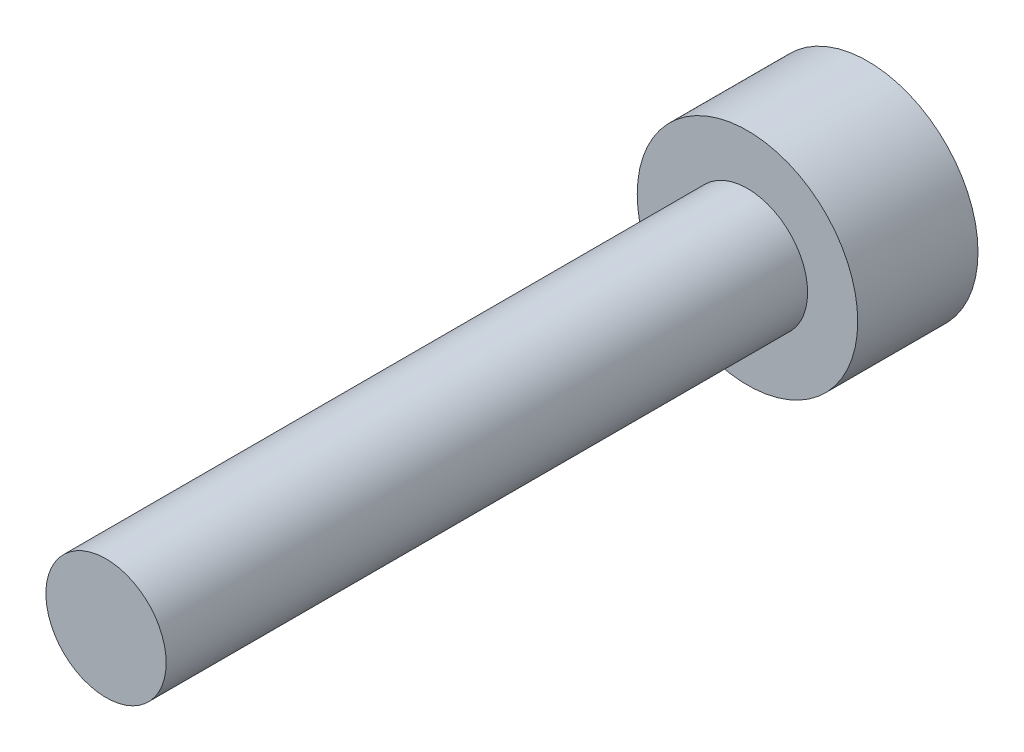
ISO-10303-21;
HEADER;
FILE_DESCRIPTION(('STEP AP214'),'2;1');
FILE_NAME('part.step','',(''),(''),'','','');
FILE_SCHEMA(('AUTOMOTIVE_DESIGN { 1 0 10303 214 1 1 1 1 }'));
ENDSEC;
DATA;
#1=APPLICATION_CONTEXT('core data for automotive mechanical design processes');
#2=APPLICATION_PROTOCOL_DEFINITION('international standard','automotive_design',2000,#1);
#3=PRODUCT_CONTEXT('',#1,'mechanical');
#4=PRODUCT('Part','Part','',(#3));
#5=PRODUCT_RELATED_PRODUCT_CATEGORY('part','',(#4));
#6=PRODUCT_DEFINITION_FORMATION('','',#4);
#7=PRODUCT_DEFINITION_CONTEXT('part definition',#1,'design');
#8=PRODUCT_DEFINITION('design','',#6,#7);
#9=PRODUCT_DEFINITION_SHAPE('','',#8);
#10=(LENGTH_UNIT() NAMED_UNIT(*) SI_UNIT(.MILLI.,.METRE.));
#11=(NAMED_UNIT(*) PLANE_ANGLE_UNIT() SI_UNIT($,.RADIAN.));
#12=(NAMED_UNIT(*) SI_UNIT($,.STERADIAN.) SOLID_ANGLE_UNIT());
#13=UNCERTAINTY_MEASURE_WITH_UNIT(LENGTH_MEASURE(1.E-05),#10,'distance_accuracy_value','');
#14=(GEOMETRIC_REPRESENTATION_CONTEXT(3) GLOBAL_UNCERTAINTY_ASSIGNED_CONTEXT((#13)) GLOBAL_UNIT_ASSIGNED_CONTEXT((#10,
#11,#12)) REPRESENTATION_CONTEXT('',''));
#15=CARTESIAN_POINT('',(0.,0.,0.));
#16=DIRECTION('',(0.,0.,1.));
#17=DIRECTION('',(1.,0.,0.));
#18=AXIS2_PLACEMENT_3D('',#15,#16,#17);
#19=CARTESIAN_POINT('',(0.,0.,16.));
#20=DIRECTION('',(0.,0.,-1.));
#21=DIRECTION('',(-1.,0.,0.));
#22=AXIS2_PLACEMENT_3D('',#19,#20,#21);
#23=CYLINDRICAL_SURFACE('',#22,1.5);
#24=CARTESIAN_POINT('',(0.,0.,16.));
#25=DIRECTION('',(0.,0.,1.));
#26=DIRECTION('',(1.,0.,0.));
#27=AXIS2_PLACEMENT_3D('',#24,#25,#26);
#28=CIRCLE('',#27,1.5);
#29=CARTESIAN_POINT('',(1.5,0.,16.));
#30=VERTEX_POINT('',#29);
#31=EDGE_CURVE('E10',#30,#30,#28,.T.);
#32=ORIENTED_EDGE('',*,*,#31,.F.);
#33=EDGE_LOOP('',(#32));
#34=FACE_BOUND('',#33,.T.);
#35=CARTESIAN_POINT('',(0.,0.,0.));
#36=DIRECTION('',(0.,0.,1.));
#37=DIRECTION('',(1.,0.,0.));
#38=AXIS2_PLACEMENT_3D('',#35,#36,#37);
#39=CIRCLE('',#38,1.5);
#40=CARTESIAN_POINT('',(1.5,0.,0.));
#41=VERTEX_POINT('',#40);
#42=EDGE_CURVE('E36',#41,#41,#39,.T.);
#43=ORIENTED_EDGE('',*,*,#42,.T.);
#44=EDGE_LOOP('',(#43));
#45=FACE_BOUND('',#44,.T.);
#46=ADVANCED_FACE('F33',(#34,#45),#23,.T.);
#47=CARTESIAN_POINT('',(0.,0.,16.));
#48=DIRECTION('',(0.,0.,1.));
#49=DIRECTION('',(1.,0.,0.));
#50=AXIS2_PLACEMENT_3D('',#47,#48,#49);
#51=PLANE('',#50);
#52=ORIENTED_EDGE('',*,*,#31,.T.);
#53=EDGE_LOOP('',(#52));
#54=FACE_BOUND('',#53,.T.);
#55=ADVANCED_FACE('F56',(#54),#51,.T.);
#56=CARTESIAN_POINT('',(0.,0.,0.));
#57=DIRECTION('',(0.,0.,-1.));
#58=DIRECTION('',(-1.,0.,0.));
#59=AXIS2_PLACEMENT_3D('',#56,#57,#58);
#60=CYLINDRICAL_SURFACE('',#59,2.75);
#61=CARTESIAN_POINT('',(0.,0.,0.));
#62=DIRECTION('',(0.,0.,1.));
#63=DIRECTION('',(1.,0.,0.));
#64=AXIS2_PLACEMENT_3D('',#61,#62,#63);
#65=CIRCLE('',#64,2.75);
#66=CARTESIAN_POINT('',(2.75,0.,0.));
#67=VERTEX_POINT('',#66);
#68=EDGE_CURVE('E43',#67,#67,#65,.T.);
#69=ORIENTED_EDGE('',*,*,#68,.F.);
#70=EDGE_LOOP('',(#69));
#71=FACE_BOUND('',#70,.T.);
#72=CARTESIAN_POINT('',(0.,0.,-3.));
#73=DIRECTION('',(0.,0.,1.));
#74=DIRECTION('',(1.,0.,0.));
#75=AXIS2_PLACEMENT_3D('',#72,#73,#74);
#76=CIRCLE('',#75,2.75);
#77=CARTESIAN_POINT('',(2.75,0.,-3.));
#78=VERTEX_POINT('',#77);
#79=EDGE_CURVE('E45',#78,#78,#76,.T.);
#80=ORIENTED_EDGE('',*,*,#79,.T.);
#81=EDGE_LOOP('',(#80));
#82=FACE_BOUND('',#81,.T.);
#83=ADVANCED_FACE('F53',(#71,#82),#60,.T.);
#84=CARTESIAN_POINT('',(0.,0.,0.));
#85=DIRECTION('',(0.,0.,1.));
#86=DIRECTION('',(1.,0.,0.));
#87=AXIS2_PLACEMENT_3D('',#84,#85,#86);
#88=PLANE('',#87);
#89=ORIENTED_EDGE('',*,*,#42,.F.);
#90=EDGE_LOOP('',(#89));
#91=FACE_BOUND('',#90,.T.);
#92=ORIENTED_EDGE('',*,*,#68,.T.);
#93=EDGE_LOOP('',(#92));
#94=FACE_BOUND('',#93,.T.);
#95=ADVANCED_FACE('F51',(#91,#94),#88,.T.);
#96=CARTESIAN_POINT('',(0.,0.,-3.));
#97=DIRECTION('',(0.,0.,1.));
#98=DIRECTION('',(1.,0.,0.));
#99=AXIS2_PLACEMENT_3D('',#96,#97,#98);
#100=PLANE('',#99);
#101=ORIENTED_EDGE('',*,*,#79,.F.);
#102=EDGE_LOOP('',(#101));
#103=FACE_BOUND('',#102,.T.);
#104=ADVANCED_FACE('F60',(#103),#100,.F.);
#105=CLOSED_SHELL('',(#46,#55,#83,#95,#104));
#106=MANIFOLD_SOLID_BREP('B2',#105);
#107=ADVANCED_BREP_SHAPE_REPRESENTATION('',(#18,#106),#14);
#108=SHAPE_DEFINITION_REPRESENTATION(#9,#107);
ENDSEC;
END-ISO-10303-21;
